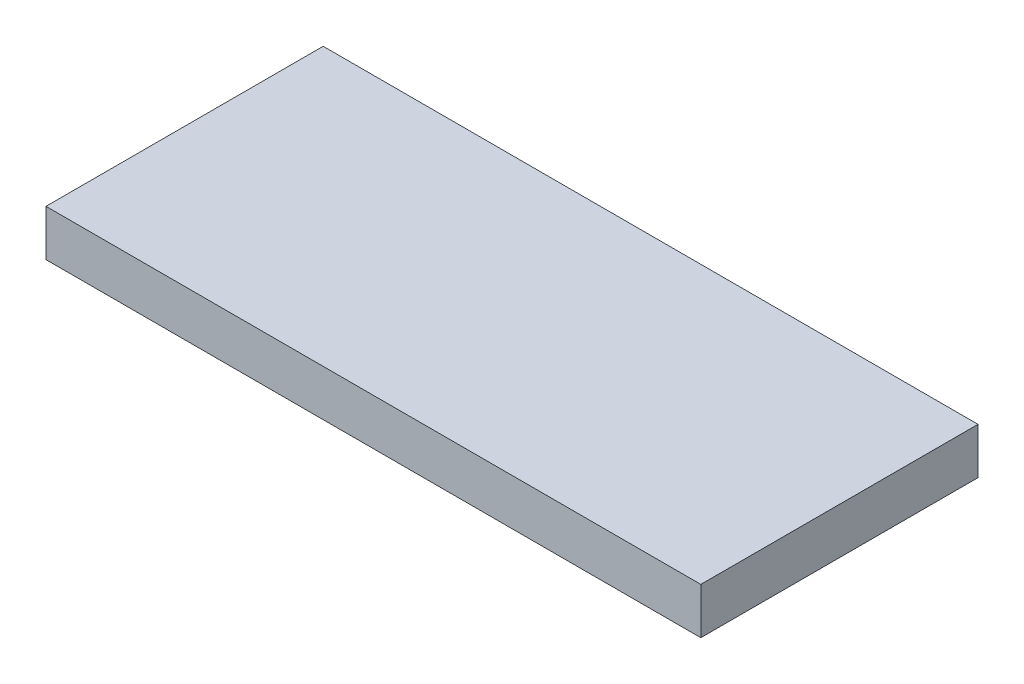
ISO-10303-21;
HEADER;
FILE_DESCRIPTION(('STEP AP214'),'2;1');
FILE_NAME('part.step','',(''),(''),'','','');
FILE_SCHEMA(('AUTOMOTIVE_DESIGN { 1 0 10303 214 1 1 1 1 }'));
ENDSEC;
DATA;
#1=APPLICATION_CONTEXT('core data for automotive mechanical design processes');
#2=APPLICATION_PROTOCOL_DEFINITION('international standard','automotive_design',2000,#1);
#3=PRODUCT_CONTEXT('',#1,'mechanical');
#4=PRODUCT('Part','Part','',(#3));
#5=PRODUCT_RELATED_PRODUCT_CATEGORY('part','',(#4));
#6=PRODUCT_DEFINITION_FORMATION('','',#4);
#7=PRODUCT_DEFINITION_CONTEXT('part definition',#1,'design');
#8=PRODUCT_DEFINITION('design','',#6,#7);
#9=PRODUCT_DEFINITION_SHAPE('','',#8);
#10=(LENGTH_UNIT() NAMED_UNIT(*) SI_UNIT(.MILLI.,.METRE.));
#11=(NAMED_UNIT(*) PLANE_ANGLE_UNIT() SI_UNIT($,.RADIAN.));
#12=(NAMED_UNIT(*) SI_UNIT($,.STERADIAN.) SOLID_ANGLE_UNIT());
#13=UNCERTAINTY_MEASURE_WITH_UNIT(LENGTH_MEASURE(1.E-05),#10,'distance_accuracy_value','');
#14=(GEOMETRIC_REPRESENTATION_CONTEXT(3) GLOBAL_UNCERTAINTY_ASSIGNED_CONTEXT((#13)) GLOBAL_UNIT_ASSIGNED_CONTEXT((#10,
#11,#12)) REPRESENTATION_CONTEXT('',''));
#15=CARTESIAN_POINT('',(0.,0.,0.));
#16=DIRECTION('',(0.,0.,1.));
#17=DIRECTION('',(1.,0.,0.));
#18=AXIS2_PLACEMENT_3D('',#15,#16,#17);
#19=CARTESIAN_POINT('',(0.,0.,76.2));
#20=DIRECTION('',(1.,0.,0.));
#21=DIRECTION('',(0.,1.,0.));
#22=AXIS2_PLACEMENT_3D('',#19,#20,#21);
#23=PLANE('',#22);
#24=DIRECTION('',(0.,-1.,0.));
#25=VECTOR('',#24,1.);
#26=CARTESIAN_POINT('',(0.,0.,0.));
#27=LINE('',#26,#25);
#28=CARTESIAN_POINT('',(0.,0.,0.));
#29=VERTEX_POINT('',#28);
#30=CARTESIAN_POINT('',(0.,-12.7,0.));
#31=VERTEX_POINT('',#30);
#32=EDGE_CURVE('E100',#29,#31,#27,.T.);
#33=ORIENTED_EDGE('',*,*,#32,.T.);
#34=DIRECTION('',(0.,0.,-1.));
#35=VECTOR('',#34,1.);
#36=CARTESIAN_POINT('',(0.,-12.7,76.2));
#37=LINE('',#36,#35);
#38=CARTESIAN_POINT('',(0.,-12.7,76.2));
#39=VERTEX_POINT('',#38);
#40=EDGE_CURVE('E11',#39,#31,#37,.T.);
#41=ORIENTED_EDGE('',*,*,#40,.F.);
#42=DIRECTION('',(0.,-1.,0.));
#43=VECTOR('',#42,1.);
#44=CARTESIAN_POINT('',(0.,0.,76.2));
#45=LINE('',#44,#43);
#46=CARTESIAN_POINT('',(0.,0.,76.2));
#47=VERTEX_POINT('',#46);
#48=EDGE_CURVE('E88',#47,#39,#45,.T.);
#49=ORIENTED_EDGE('',*,*,#48,.F.);
#50=DIRECTION('',(0.,0.,-1.));
#51=VECTOR('',#50,1.);
#52=CARTESIAN_POINT('',(0.,0.,76.2));
#53=LINE('',#52,#51);
#54=EDGE_CURVE('E96',#47,#29,#53,.T.);
#55=ORIENTED_EDGE('',*,*,#54,.T.);
#56=EDGE_LOOP('',(#33,#41,#49,#55));
#57=FACE_BOUND('',#56,.T.);
#58=ADVANCED_FACE('F37',(#57),#23,.F.);
#59=CARTESIAN_POINT('',(0.,-12.7,76.2));
#60=DIRECTION('',(0.,1.,0.));
#61=DIRECTION('',(0.,0.,1.));
#62=AXIS2_PLACEMENT_3D('',#59,#60,#61);
#63=PLANE('',#62);
#64=DIRECTION('',(1.,0.,0.));
#65=VECTOR('',#64,1.);
#66=CARTESIAN_POINT('',(0.,-12.7,0.));
#67=LINE('',#66,#65);
#68=CARTESIAN_POINT('',(180.,-12.7,0.));
#69=VERTEX_POINT('',#68);
#70=EDGE_CURVE('E92',#31,#69,#67,.T.);
#71=ORIENTED_EDGE('',*,*,#70,.T.);
#72=DIRECTION('',(0.,0.,-1.));
#73=VECTOR('',#72,1.);
#74=CARTESIAN_POINT('',(180.,-12.7,76.2));
#75=LINE('',#74,#73);
#76=CARTESIAN_POINT('',(180.,-12.7,76.2));
#77=VERTEX_POINT('',#76);
#78=EDGE_CURVE('E45',#77,#69,#75,.T.);
#79=ORIENTED_EDGE('',*,*,#78,.F.);
#80=DIRECTION('',(1.,0.,0.));
#81=VECTOR('',#80,1.);
#82=CARTESIAN_POINT('',(0.,-12.7,76.2));
#83=LINE('',#82,#81);
#84=EDGE_CURVE('E83',#39,#77,#83,.T.);
#85=ORIENTED_EDGE('',*,*,#84,.F.);
#86=ORIENTED_EDGE('',*,*,#40,.T.);
#87=EDGE_LOOP('',(#71,#79,#85,#86));
#88=FACE_BOUND('',#87,.T.);
#89=ADVANCED_FACE('F91',(#88),#63,.F.);
#90=CARTESIAN_POINT('',(180.,0.,76.2));
#91=DIRECTION('',(-1.,0.,0.));
#92=DIRECTION('',(0.,0.,1.));
#93=AXIS2_PLACEMENT_3D('',#90,#91,#92);
#94=PLANE('',#93);
#95=DIRECTION('',(0.,1.,0.));
#96=VECTOR('',#95,1.);
#97=CARTESIAN_POINT('',(180.,0.,0.));
#98=LINE('',#97,#96);
#99=CARTESIAN_POINT('',(180.,0.,0.));
#100=VERTEX_POINT('',#99);
#101=EDGE_CURVE('E70',#69,#100,#98,.T.);
#102=ORIENTED_EDGE('',*,*,#101,.T.);
#103=DIRECTION('',(0.,0.,-1.));
#104=VECTOR('',#103,1.);
#105=CARTESIAN_POINT('',(180.,0.,76.2));
#106=LINE('',#105,#104);
#107=CARTESIAN_POINT('',(180.,0.,76.2));
#108=VERTEX_POINT('',#107);
#109=EDGE_CURVE('E93',#108,#100,#106,.T.);
#110=ORIENTED_EDGE('',*,*,#109,.F.);
#111=DIRECTION('',(0.,1.,0.));
#112=VECTOR('',#111,1.);
#113=CARTESIAN_POINT('',(180.,0.,76.2));
#114=LINE('',#113,#112);
#115=EDGE_CURVE('E86',#77,#108,#114,.T.);
#116=ORIENTED_EDGE('',*,*,#115,.F.);
#117=ORIENTED_EDGE('',*,*,#78,.T.);
#118=EDGE_LOOP('',(#102,#110,#116,#117));
#119=FACE_BOUND('',#118,.T.);
#120=ADVANCED_FACE('F94',(#119),#94,.F.);
#121=CARTESIAN_POINT('',(0.,0.,76.2));
#122=DIRECTION('',(0.,-1.,0.));
#123=DIRECTION('',(0.,0.,-1.));
#124=AXIS2_PLACEMENT_3D('',#121,#122,#123);
#125=PLANE('',#124);
#126=DIRECTION('',(-1.,0.,0.));
#127=VECTOR('',#126,1.);
#128=CARTESIAN_POINT('',(0.,0.,0.));
#129=LINE('',#128,#127);
#130=EDGE_CURVE('E76',#100,#29,#129,.T.);
#131=ORIENTED_EDGE('',*,*,#130,.T.);
#132=ORIENTED_EDGE('',*,*,#54,.F.);
#133=DIRECTION('',(-1.,0.,0.));
#134=VECTOR('',#133,1.);
#135=CARTESIAN_POINT('',(0.,0.,76.2));
#136=LINE('',#135,#134);
#137=EDGE_CURVE('E53',#108,#47,#136,.T.);
#138=ORIENTED_EDGE('',*,*,#137,.F.);
#139=ORIENTED_EDGE('',*,*,#109,.T.);
#140=EDGE_LOOP('',(#131,#132,#138,#139));
#141=FACE_BOUND('',#140,.T.);
#142=ADVANCED_FACE('F107',(#141),#125,.F.);
#143=CARTESIAN_POINT('',(0.,0.,76.2));
#144=DIRECTION('',(0.,0.,1.));
#145=DIRECTION('',(1.,0.,0.));
#146=AXIS2_PLACEMENT_3D('',#143,#144,#145);
#147=PLANE('',#146);
#148=ORIENTED_EDGE('',*,*,#48,.T.);
#149=ORIENTED_EDGE('',*,*,#84,.T.);
#150=ORIENTED_EDGE('',*,*,#115,.T.);
#151=ORIENTED_EDGE('',*,*,#137,.T.);
#152=EDGE_LOOP('',(#148,#149,#150,#151));
#153=FACE_BOUND('',#152,.T.);
#154=ADVANCED_FACE('F84',(#153),#147,.T.);
#155=CARTESIAN_POINT('',(0.,0.,0.));
#156=DIRECTION('',(0.,0.,1.));
#157=DIRECTION('',(1.,0.,0.));
#158=AXIS2_PLACEMENT_3D('',#155,#156,#157);
#159=PLANE('',#158);
#160=ORIENTED_EDGE('',*,*,#32,.F.);
#161=ORIENTED_EDGE('',*,*,#130,.F.);
#162=ORIENTED_EDGE('',*,*,#101,.F.);
#163=ORIENTED_EDGE('',*,*,#70,.F.);
#164=EDGE_LOOP('',(#160,#161,#162,#163));
#165=FACE_BOUND('',#164,.T.);
#166=ADVANCED_FACE('F110',(#165),#159,.F.);
#167=CLOSED_SHELL('',(#58,#89,#120,#142,#154,#166));
#168=MANIFOLD_SOLID_BREP('B2',#167);
#169=ADVANCED_BREP_SHAPE_REPRESENTATION('',(#18,#168),#14);
#170=SHAPE_DEFINITION_REPRESENTATION(#9,#169);
ENDSEC;
END-ISO-10303-21;
